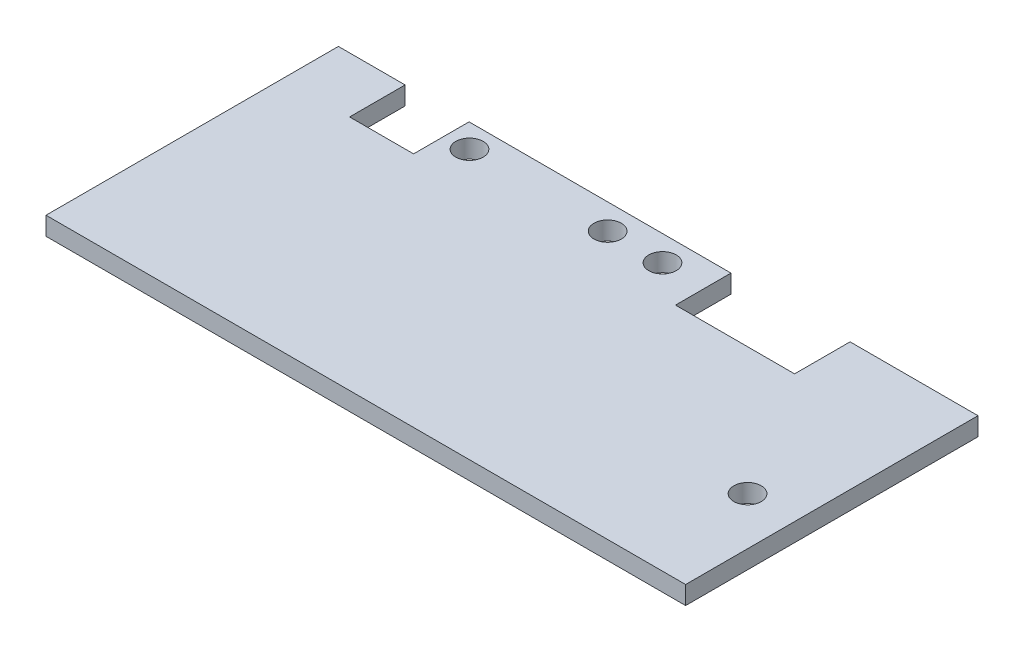
ISO-10303-21;
HEADER;
FILE_DESCRIPTION(('STEP AP214'),'2;1');
FILE_NAME('part.step','',(''),(''),'','','');
FILE_SCHEMA(('AUTOMOTIVE_DESIGN { 1 0 10303 214 1 1 1 1 }'));
ENDSEC;
DATA;
#1=APPLICATION_CONTEXT('core data for automotive mechanical design processes');
#2=APPLICATION_PROTOCOL_DEFINITION('international standard','automotive_design',2000,#1);
#3=PRODUCT_CONTEXT('',#1,'mechanical');
#4=PRODUCT('Part','Part','',(#3));
#5=PRODUCT_RELATED_PRODUCT_CATEGORY('part','',(#4));
#6=PRODUCT_DEFINITION_FORMATION('','',#4);
#7=PRODUCT_DEFINITION_CONTEXT('part definition',#1,'design');
#8=PRODUCT_DEFINITION('design','',#6,#7);
#9=PRODUCT_DEFINITION_SHAPE('','',#8);
#10=(LENGTH_UNIT() NAMED_UNIT(*) SI_UNIT(.MILLI.,.METRE.));
#11=(NAMED_UNIT(*) PLANE_ANGLE_UNIT() SI_UNIT($,.RADIAN.));
#12=(NAMED_UNIT(*) SI_UNIT($,.STERADIAN.) SOLID_ANGLE_UNIT());
#13=UNCERTAINTY_MEASURE_WITH_UNIT(LENGTH_MEASURE(1.E-05),#10,'distance_accuracy_value','');
#14=(GEOMETRIC_REPRESENTATION_CONTEXT(3) GLOBAL_UNCERTAINTY_ASSIGNED_CONTEXT((#13)) GLOBAL_UNIT_ASSIGNED_CONTEXT((#10,
#11,#12)) REPRESENTATION_CONTEXT('',''));
#15=CARTESIAN_POINT('',(0.,0.,0.));
#16=DIRECTION('',(0.,0.,1.));
#17=DIRECTION('',(1.,0.,0.));
#18=AXIS2_PLACEMENT_3D('',#15,#16,#17);
#19=CARTESIAN_POINT('',(35.,1.,0.));
#20=DIRECTION('',(0.,0.,-1.));
#21=DIRECTION('',(-1.,0.,0.));
#22=AXIS2_PLACEMENT_3D('',#19,#20,#21);
#23=PLANE('',#22);
#24=DIRECTION('',(1.,0.,0.));
#25=VECTOR('',#24,1.);
#26=CARTESIAN_POINT('',(35.,0.,0.));
#27=LINE('',#26,#25);
#28=CARTESIAN_POINT('',(0.,0.,0.));
#29=VERTEX_POINT('',#28);
#30=CARTESIAN_POINT('',(35.,0.,0.));
#31=VERTEX_POINT('',#30);
#32=EDGE_CURVE('E168',#29,#31,#27,.T.);
#33=ORIENTED_EDGE('',*,*,#32,.T.);
#34=DIRECTION('',(0.,-1.,0.));
#35=VECTOR('',#34,1.);
#36=CARTESIAN_POINT('',(35.,1.,0.));
#37=LINE('',#36,#35);
#38=CARTESIAN_POINT('',(35.,1.,0.));
#39=VERTEX_POINT('',#38);
#40=EDGE_CURVE('E11',#39,#31,#37,.T.);
#41=ORIENTED_EDGE('',*,*,#40,.F.);
#42=DIRECTION('',(1.,0.,0.));
#43=VECTOR('',#42,1.);
#44=CARTESIAN_POINT('',(35.,1.,0.));
#45=LINE('',#44,#43);
#46=CARTESIAN_POINT('',(0.,1.,0.));
#47=VERTEX_POINT('',#46);
#48=EDGE_CURVE('E203',#47,#39,#45,.T.);
#49=ORIENTED_EDGE('',*,*,#48,.F.);
#50=DIRECTION('',(0.,-1.,0.));
#51=VECTOR('',#50,1.);
#52=CARTESIAN_POINT('',(0.,1.,0.));
#53=LINE('',#52,#51);
#54=EDGE_CURVE('E164',#47,#29,#53,.T.);
#55=ORIENTED_EDGE('',*,*,#54,.T.);
#56=EDGE_LOOP('',(#33,#41,#49,#55));
#57=FACE_BOUND('',#56,.T.);
#58=ADVANCED_FACE('F43',(#57),#23,.F.);
#59=CARTESIAN_POINT('',(35.,1.,-16.));
#60=DIRECTION('',(-1.,0.,0.));
#61=DIRECTION('',(0.,0.,1.));
#62=AXIS2_PLACEMENT_3D('',#59,#60,#61);
#63=PLANE('',#62);
#64=DIRECTION('',(0.,0.,-1.));
#65=VECTOR('',#64,1.);
#66=CARTESIAN_POINT('',(35.,0.,-16.));
#67=LINE('',#66,#65);
#68=CARTESIAN_POINT('',(35.,0.,-16.));
#69=VERTEX_POINT('',#68);
#70=EDGE_CURVE('E172',#31,#69,#67,.T.);
#71=ORIENTED_EDGE('',*,*,#70,.T.);
#72=DIRECTION('',(0.,-1.,0.));
#73=VECTOR('',#72,1.);
#74=CARTESIAN_POINT('',(35.,1.,-16.));
#75=LINE('',#74,#73);
#76=CARTESIAN_POINT('',(35.,1.,-16.));
#77=VERTEX_POINT('',#76);
#78=EDGE_CURVE('E52',#77,#69,#75,.T.);
#79=ORIENTED_EDGE('',*,*,#78,.F.);
#80=DIRECTION('',(0.,0.,-1.));
#81=VECTOR('',#80,1.);
#82=CARTESIAN_POINT('',(35.,1.,-16.));
#83=LINE('',#82,#81);
#84=EDGE_CURVE('E115',#39,#77,#83,.T.);
#85=ORIENTED_EDGE('',*,*,#84,.F.);
#86=ORIENTED_EDGE('',*,*,#40,.T.);
#87=EDGE_LOOP('',(#71,#79,#85,#86));
#88=FACE_BOUND('',#87,.T.);
#89=ADVANCED_FACE('F298',(#88),#63,.F.);
#90=CARTESIAN_POINT('',(28.,1.,-16.));
#91=DIRECTION('',(0.,0.,1.));
#92=DIRECTION('',(1.,0.,0.));
#93=AXIS2_PLACEMENT_3D('',#90,#91,#92);
#94=PLANE('',#93);
#95=DIRECTION('',(-1.,0.,0.));
#96=VECTOR('',#95,1.);
#97=CARTESIAN_POINT('',(28.,0.,-16.));
#98=LINE('',#97,#96);
#99=CARTESIAN_POINT('',(28.,0.,-16.));
#100=VERTEX_POINT('',#99);
#101=EDGE_CURVE('E176',#69,#100,#98,.T.);
#102=ORIENTED_EDGE('',*,*,#101,.T.);
#103=DIRECTION('',(0.,-1.,0.));
#104=VECTOR('',#103,1.);
#105=CARTESIAN_POINT('',(28.,1.,-16.));
#106=LINE('',#105,#104);
#107=CARTESIAN_POINT('',(28.,1.,-16.));
#108=VERTEX_POINT('',#107);
#109=EDGE_CURVE('E230',#108,#100,#106,.T.);
#110=ORIENTED_EDGE('',*,*,#109,.F.);
#111=DIRECTION('',(-1.,0.,0.));
#112=VECTOR('',#111,1.);
#113=CARTESIAN_POINT('',(28.,1.,-16.));
#114=LINE('',#113,#112);
#115=EDGE_CURVE('E240',#77,#108,#114,.T.);
#116=ORIENTED_EDGE('',*,*,#115,.F.);
#117=ORIENTED_EDGE('',*,*,#78,.T.);
#118=EDGE_LOOP('',(#102,#110,#116,#117));
#119=FACE_BOUND('',#118,.T.);
#120=ADVANCED_FACE('F238',(#119),#94,.F.);
#121=CARTESIAN_POINT('',(28.,1.,-12.964));
#122=DIRECTION('',(1.,0.,0.));
#123=DIRECTION('',(0.,0.,-1.));
#124=AXIS2_PLACEMENT_3D('',#121,#122,#123);
#125=PLANE('',#124);
#126=DIRECTION('',(0.,0.,1.));
#127=VECTOR('',#126,1.);
#128=CARTESIAN_POINT('',(28.,0.,-12.964));
#129=LINE('',#128,#127);
#130=CARTESIAN_POINT('',(28.,0.,-12.964));
#131=VERTEX_POINT('',#130);
#132=EDGE_CURVE('E179',#100,#131,#129,.T.);
#133=ORIENTED_EDGE('',*,*,#132,.T.);
#134=DIRECTION('',(0.,-1.,0.));
#135=VECTOR('',#134,1.);
#136=CARTESIAN_POINT('',(28.,1.,-12.964));
#137=LINE('',#136,#135);
#138=CARTESIAN_POINT('',(28.,1.,-12.964));
#139=VERTEX_POINT('',#138);
#140=EDGE_CURVE('E226',#139,#131,#137,.T.);
#141=ORIENTED_EDGE('',*,*,#140,.F.);
#142=DIRECTION('',(0.,0.,1.));
#143=VECTOR('',#142,1.);
#144=CARTESIAN_POINT('',(28.,1.,-12.964));
#145=LINE('',#144,#143);
#146=EDGE_CURVE('E259',#108,#139,#145,.T.);
#147=ORIENTED_EDGE('',*,*,#146,.F.);
#148=ORIENTED_EDGE('',*,*,#109,.T.);
#149=EDGE_LOOP('',(#133,#141,#147,#148));
#150=FACE_BOUND('',#149,.T.);
#151=ADVANCED_FACE('F249',(#150),#125,.F.);
#152=CARTESIAN_POINT('',(21.483,1.,-12.964));
#153=DIRECTION('',(0.,0.,1.));
#154=DIRECTION('',(1.,0.,0.));
#155=AXIS2_PLACEMENT_3D('',#152,#153,#154);
#156=PLANE('',#155);
#157=DIRECTION('',(-1.,0.,0.));
#158=VECTOR('',#157,1.);
#159=CARTESIAN_POINT('',(21.483,0.,-12.964));
#160=LINE('',#159,#158);
#161=CARTESIAN_POINT('',(21.483,0.,-12.964));
#162=VERTEX_POINT('',#161);
#163=EDGE_CURVE('E182',#131,#162,#160,.T.);
#164=ORIENTED_EDGE('',*,*,#163,.T.);
#165=DIRECTION('',(0.,-1.,0.));
#166=VECTOR('',#165,1.);
#167=CARTESIAN_POINT('',(21.483,1.,-12.964));
#168=LINE('',#167,#166);
#169=CARTESIAN_POINT('',(21.483,1.,-12.964));
#170=VERTEX_POINT('',#169);
#171=EDGE_CURVE('E222',#170,#162,#168,.T.);
#172=ORIENTED_EDGE('',*,*,#171,.F.);
#173=DIRECTION('',(-1.,0.,0.));
#174=VECTOR('',#173,1.);
#175=CARTESIAN_POINT('',(21.483,1.,-12.964));
#176=LINE('',#175,#174);
#177=EDGE_CURVE('E255',#139,#170,#176,.T.);
#178=ORIENTED_EDGE('',*,*,#177,.F.);
#179=ORIENTED_EDGE('',*,*,#140,.T.);
#180=EDGE_LOOP('',(#164,#172,#178,#179));
#181=FACE_BOUND('',#180,.T.);
#182=ADVANCED_FACE('F253',(#181),#156,.F.);
#183=CARTESIAN_POINT('',(21.483,1.,-16.));
#184=DIRECTION('',(-1.,0.,0.));
#185=DIRECTION('',(0.,0.,1.));
#186=AXIS2_PLACEMENT_3D('',#183,#184,#185);
#187=PLANE('',#186);
#188=DIRECTION('',(0.,0.,-1.));
#189=VECTOR('',#188,1.);
#190=CARTESIAN_POINT('',(21.483,0.,-16.));
#191=LINE('',#190,#189);
#192=CARTESIAN_POINT('',(21.483,0.,-16.));
#193=VERTEX_POINT('',#192);
#194=EDGE_CURVE('E185',#162,#193,#191,.T.);
#195=ORIENTED_EDGE('',*,*,#194,.T.);
#196=DIRECTION('',(0.,-1.,0.));
#197=VECTOR('',#196,1.);
#198=CARTESIAN_POINT('',(21.483,1.,-16.));
#199=LINE('',#198,#197);
#200=CARTESIAN_POINT('',(21.483,1.,-16.));
#201=VERTEX_POINT('',#200);
#202=EDGE_CURVE('E218',#201,#193,#199,.T.);
#203=ORIENTED_EDGE('',*,*,#202,.F.);
#204=DIRECTION('',(0.,0.,-1.));
#205=VECTOR('',#204,1.);
#206=CARTESIAN_POINT('',(21.483,1.,-16.));
#207=LINE('',#206,#205);
#208=EDGE_CURVE('E258',#170,#201,#207,.T.);
#209=ORIENTED_EDGE('',*,*,#208,.F.);
#210=ORIENTED_EDGE('',*,*,#171,.T.);
#211=EDGE_LOOP('',(#195,#203,#209,#210));
#212=FACE_BOUND('',#211,.T.);
#213=ADVANCED_FACE('F311',(#212),#187,.F.);
#214=CARTESIAN_POINT('',(7.15,1.,-16.));
#215=DIRECTION('',(0.,0.,1.));
#216=DIRECTION('',(1.,0.,0.));
#217=AXIS2_PLACEMENT_3D('',#214,#215,#216);
#218=PLANE('',#217);
#219=DIRECTION('',(-1.,0.,0.));
#220=VECTOR('',#219,1.);
#221=CARTESIAN_POINT('',(7.15,0.,-16.));
#222=LINE('',#221,#220);
#223=CARTESIAN_POINT('',(7.15,0.,-16.));
#224=VERTEX_POINT('',#223);
#225=EDGE_CURVE('E188',#193,#224,#222,.T.);
#226=ORIENTED_EDGE('',*,*,#225,.T.);
#227=DIRECTION('',(0.,-1.,0.));
#228=VECTOR('',#227,1.);
#229=CARTESIAN_POINT('',(7.15,1.,-16.));
#230=LINE('',#229,#228);
#231=CARTESIAN_POINT('',(7.15,1.,-16.));
#232=VERTEX_POINT('',#231);
#233=EDGE_CURVE('E214',#232,#224,#230,.T.);
#234=ORIENTED_EDGE('',*,*,#233,.F.);
#235=DIRECTION('',(-1.,0.,0.));
#236=VECTOR('',#235,1.);
#237=CARTESIAN_POINT('',(7.15,1.,-16.));
#238=LINE('',#237,#236);
#239=EDGE_CURVE('E263',#201,#232,#238,.T.);
#240=ORIENTED_EDGE('',*,*,#239,.F.);
#241=ORIENTED_EDGE('',*,*,#202,.T.);
#242=EDGE_LOOP('',(#226,#234,#240,#241));
#243=FACE_BOUND('',#242,.T.);
#244=ADVANCED_FACE('F314',(#243),#218,.F.);
#245=CARTESIAN_POINT('',(7.15,1.,-12.964));
#246=DIRECTION('',(1.,0.,0.));
#247=DIRECTION('',(0.,0.,-1.));
#248=AXIS2_PLACEMENT_3D('',#245,#246,#247);
#249=PLANE('',#248);
#250=DIRECTION('',(0.,0.,1.));
#251=VECTOR('',#250,1.);
#252=CARTESIAN_POINT('',(7.15,0.,-12.964));
#253=LINE('',#252,#251);
#254=CARTESIAN_POINT('',(7.15,0.,-12.964));
#255=VERTEX_POINT('',#254);
#256=EDGE_CURVE('E191',#224,#255,#253,.T.);
#257=ORIENTED_EDGE('',*,*,#256,.T.);
#258=DIRECTION('',(0.,-1.,0.));
#259=VECTOR('',#258,1.);
#260=CARTESIAN_POINT('',(7.15,1.,-12.964));
#261=LINE('',#260,#259);
#262=CARTESIAN_POINT('',(7.15,1.,-12.964));
#263=VERTEX_POINT('',#262);
#264=EDGE_CURVE('E210',#263,#255,#261,.T.);
#265=ORIENTED_EDGE('',*,*,#264,.F.);
#266=DIRECTION('',(0.,0.,1.));
#267=VECTOR('',#266,1.);
#268=CARTESIAN_POINT('',(7.15,1.,-12.964));
#269=LINE('',#268,#267);
#270=EDGE_CURVE('E270',#232,#263,#269,.T.);
#271=ORIENTED_EDGE('',*,*,#270,.F.);
#272=ORIENTED_EDGE('',*,*,#233,.T.);
#273=EDGE_LOOP('',(#257,#265,#271,#272));
#274=FACE_BOUND('',#273,.T.);
#275=ADVANCED_FACE('F278',(#274),#249,.F.);
#276=CARTESIAN_POINT('',(3.65,1.,-12.964));
#277=DIRECTION('',(0.,0.,1.));
#278=DIRECTION('',(1.,0.,0.));
#279=AXIS2_PLACEMENT_3D('',#276,#277,#278);
#280=PLANE('',#279);
#281=DIRECTION('',(-1.,0.,0.));
#282=VECTOR('',#281,1.);
#283=CARTESIAN_POINT('',(3.65,0.,-12.964));
#284=LINE('',#283,#282);
#285=CARTESIAN_POINT('',(3.65,0.,-12.964));
#286=VERTEX_POINT('',#285);
#287=EDGE_CURVE('E194',#255,#286,#284,.T.);
#288=ORIENTED_EDGE('',*,*,#287,.T.);
#289=DIRECTION('',(0.,-1.,0.));
#290=VECTOR('',#289,1.);
#291=CARTESIAN_POINT('',(3.65,1.,-12.964));
#292=LINE('',#291,#290);
#293=CARTESIAN_POINT('',(3.65,1.,-12.964));
#294=VERTEX_POINT('',#293);
#295=EDGE_CURVE('E157',#294,#286,#292,.T.);
#296=ORIENTED_EDGE('',*,*,#295,.F.);
#297=DIRECTION('',(-1.,0.,0.));
#298=VECTOR('',#297,1.);
#299=CARTESIAN_POINT('',(3.65,1.,-12.964));
#300=LINE('',#299,#298);
#301=EDGE_CURVE('E146',#263,#294,#300,.T.);
#302=ORIENTED_EDGE('',*,*,#301,.F.);
#303=ORIENTED_EDGE('',*,*,#264,.T.);
#304=EDGE_LOOP('',(#288,#296,#302,#303));
#305=FACE_BOUND('',#304,.T.);
#306=ADVANCED_FACE('F282',(#305),#280,.F.);
#307=CARTESIAN_POINT('',(3.65,1.,-16.));
#308=DIRECTION('',(-1.,0.,0.));
#309=DIRECTION('',(0.,0.,1.));
#310=AXIS2_PLACEMENT_3D('',#307,#308,#309);
#311=PLANE('',#310);
#312=DIRECTION('',(0.,0.,-1.));
#313=VECTOR('',#312,1.);
#314=CARTESIAN_POINT('',(3.65,0.,-16.));
#315=LINE('',#314,#313);
#316=CARTESIAN_POINT('',(3.65,0.,-16.));
#317=VERTEX_POINT('',#316);
#318=EDGE_CURVE('E155',#286,#317,#315,.T.);
#319=ORIENTED_EDGE('',*,*,#318,.T.);
#320=DIRECTION('',(0.,-1.,0.));
#321=VECTOR('',#320,1.);
#322=CARTESIAN_POINT('',(3.65,1.,-16.));
#323=LINE('',#322,#321);
#324=CARTESIAN_POINT('',(3.65,1.,-16.));
#325=VERTEX_POINT('',#324);
#326=EDGE_CURVE('E152',#325,#317,#323,.T.);
#327=ORIENTED_EDGE('',*,*,#326,.F.);
#328=DIRECTION('',(0.,0.,-1.));
#329=VECTOR('',#328,1.);
#330=CARTESIAN_POINT('',(3.65,1.,-16.));
#331=LINE('',#330,#329);
#332=EDGE_CURVE('E140',#294,#325,#331,.T.);
#333=ORIENTED_EDGE('',*,*,#332,.F.);
#334=ORIENTED_EDGE('',*,*,#295,.T.);
#335=EDGE_LOOP('',(#319,#327,#333,#334));
#336=FACE_BOUND('',#335,.T.);
#337=ADVANCED_FACE('F153',(#336),#311,.F.);
#338=CARTESIAN_POINT('',(0.,1.,-16.));
#339=DIRECTION('',(0.,0.,1.));
#340=DIRECTION('',(1.,0.,0.));
#341=AXIS2_PLACEMENT_3D('',#338,#339,#340);
#342=PLANE('',#341);
#343=DIRECTION('',(-1.,0.,0.));
#344=VECTOR('',#343,1.);
#345=CARTESIAN_POINT('',(0.,0.,-16.));
#346=LINE('',#345,#344);
#347=CARTESIAN_POINT('',(0.,0.,-16.));
#348=VERTEX_POINT('',#347);
#349=EDGE_CURVE('E101',#317,#348,#346,.T.);
#350=ORIENTED_EDGE('',*,*,#349,.T.);
#351=DIRECTION('',(0.,-1.,0.));
#352=VECTOR('',#351,1.);
#353=CARTESIAN_POINT('',(0.,1.,-16.));
#354=LINE('',#353,#352);
#355=CARTESIAN_POINT('',(0.,1.,-16.));
#356=VERTEX_POINT('',#355);
#357=EDGE_CURVE('E158',#356,#348,#354,.T.);
#358=ORIENTED_EDGE('',*,*,#357,.F.);
#359=DIRECTION('',(-1.,0.,0.));
#360=VECTOR('',#359,1.);
#361=CARTESIAN_POINT('',(0.,1.,-16.));
#362=LINE('',#361,#360);
#363=EDGE_CURVE('E144',#325,#356,#362,.T.);
#364=ORIENTED_EDGE('',*,*,#363,.F.);
#365=ORIENTED_EDGE('',*,*,#326,.T.);
#366=EDGE_LOOP('',(#350,#358,#364,#365));
#367=FACE_BOUND('',#366,.T.);
#368=ADVANCED_FACE('F160',(#367),#342,.F.);
#369=CARTESIAN_POINT('',(0.,1.,0.));
#370=DIRECTION('',(1.,0.,0.));
#371=DIRECTION('',(0.,0.,-1.));
#372=AXIS2_PLACEMENT_3D('',#369,#370,#371);
#373=PLANE('',#372);
#374=DIRECTION('',(0.,0.,1.));
#375=VECTOR('',#374,1.);
#376=CARTESIAN_POINT('',(0.,0.,0.));
#377=LINE('',#376,#375);
#378=EDGE_CURVE('E107',#348,#29,#377,.T.);
#379=ORIENTED_EDGE('',*,*,#378,.T.);
#380=ORIENTED_EDGE('',*,*,#54,.F.);
#381=DIRECTION('',(0.,0.,1.));
#382=VECTOR('',#381,1.);
#383=CARTESIAN_POINT('',(0.,1.,0.));
#384=LINE('',#383,#382);
#385=EDGE_CURVE('E60',#356,#47,#384,.T.);
#386=ORIENTED_EDGE('',*,*,#385,.F.);
#387=ORIENTED_EDGE('',*,*,#357,.T.);
#388=EDGE_LOOP('',(#379,#380,#386,#387));
#389=FACE_BOUND('',#388,.T.);
#390=ADVANCED_FACE('F286',(#389),#373,.F.);
#391=CARTESIAN_POINT('',(0.,1.,0.));
#392=DIRECTION('',(0.,-1.,0.));
#393=DIRECTION('',(0.,0.,-1.));
#394=AXIS2_PLACEMENT_3D('',#391,#392,#393);
#395=PLANE('',#394);
#396=CARTESIAN_POINT('',(8.46,1.,-14.713));
#397=DIRECTION('',(0.,1.,0.));
#398=DIRECTION('',(0.,0.,1.));
#399=AXIS2_PLACEMENT_3D('',#396,#397,#398);
#400=CIRCLE('',#399,0.750000000000002);
#401=CARTESIAN_POINT('',(8.46,1.,-13.963));
#402=VERTEX_POINT('',#401);
#403=EDGE_CURVE('E486',#402,#402,#400,.T.);
#404=ORIENTED_EDGE('',*,*,#403,.F.);
#405=EDGE_LOOP('',(#404));
#406=FACE_BOUND('',#405,.T.);
#407=CARTESIAN_POINT('',(16.121,1.,-14.613));
#408=DIRECTION('',(0.,1.,0.));
#409=DIRECTION('',(0.,0.,1.));
#410=AXIS2_PLACEMENT_3D('',#407,#408,#409);
#411=CIRCLE('',#410,0.749999999999999);
#412=CARTESIAN_POINT('',(16.121,1.,-13.863));
#413=VERTEX_POINT('',#412);
#414=EDGE_CURVE('E488',#413,#413,#411,.T.);
#415=ORIENTED_EDGE('',*,*,#414,.F.);
#416=EDGE_LOOP('',(#415));
#417=FACE_BOUND('',#416,.T.);
#418=CARTESIAN_POINT('',(19.121,1.,-14.613));
#419=DIRECTION('',(0.,1.,0.));
#420=DIRECTION('',(0.,0.,1.));
#421=AXIS2_PLACEMENT_3D('',#418,#419,#420);
#422=CIRCLE('',#421,0.749999999999999);
#423=CARTESIAN_POINT('',(19.121,1.,-13.863));
#424=VERTEX_POINT('',#423);
#425=EDGE_CURVE('E501',#424,#424,#422,.T.);
#426=ORIENTED_EDGE('',*,*,#425,.F.);
#427=EDGE_LOOP('',(#426));
#428=FACE_BOUND('',#427,.T.);
#429=CARTESIAN_POINT('',(32.39,1.,-6.));
#430=DIRECTION('',(0.,1.,0.));
#431=DIRECTION('',(0.,0.,1.));
#432=AXIS2_PLACEMENT_3D('',#429,#430,#431);
#433=CIRCLE('',#432,0.749999999999999);
#434=CARTESIAN_POINT('',(32.39,1.,-5.25));
#435=VERTEX_POINT('',#434);
#436=EDGE_CURVE('E492',#435,#435,#433,.T.);
#437=ORIENTED_EDGE('',*,*,#436,.F.);
#438=EDGE_LOOP('',(#437));
#439=FACE_BOUND('',#438,.T.);
#440=ORIENTED_EDGE('',*,*,#48,.T.);
#441=ORIENTED_EDGE('',*,*,#84,.T.);
#442=ORIENTED_EDGE('',*,*,#115,.T.);
#443=ORIENTED_EDGE('',*,*,#146,.T.);
#444=ORIENTED_EDGE('',*,*,#177,.T.);
#445=ORIENTED_EDGE('',*,*,#208,.T.);
#446=ORIENTED_EDGE('',*,*,#239,.T.);
#447=ORIENTED_EDGE('',*,*,#270,.T.);
#448=ORIENTED_EDGE('',*,*,#301,.T.);
#449=ORIENTED_EDGE('',*,*,#332,.T.);
#450=ORIENTED_EDGE('',*,*,#363,.T.);
#451=ORIENTED_EDGE('',*,*,#385,.T.);
#452=EDGE_LOOP('',(#440,#441,#442,#443,#444,#445,#446,#447,#448,#449,#450,#451));
#453=FACE_BOUND('',#452,.T.);
#454=ADVANCED_FACE('F142',(#406,#417,#428,#439,#453),#395,.F.);
#455=CARTESIAN_POINT('',(0.,0.,0.));
#456=DIRECTION('',(0.,-1.,0.));
#457=DIRECTION('',(0.,0.,-1.));
#458=AXIS2_PLACEMENT_3D('',#455,#456,#457);
#459=PLANE('',#458);
#460=CARTESIAN_POINT('',(8.46,0.,-14.713));
#461=DIRECTION('',(0.,1.,0.));
#462=DIRECTION('',(0.,0.,1.));
#463=AXIS2_PLACEMENT_3D('',#460,#461,#462);
#464=CIRCLE('',#463,0.750000000000002);
#465=CARTESIAN_POINT('',(8.46,0.,-13.963));
#466=VERTEX_POINT('',#465);
#467=EDGE_CURVE('E483',#466,#466,#464,.T.);
#468=ORIENTED_EDGE('',*,*,#467,.T.);
#469=EDGE_LOOP('',(#468));
#470=FACE_BOUND('',#469,.T.);
#471=CARTESIAN_POINT('',(16.121,0.,-14.613));
#472=DIRECTION('',(0.,1.,0.));
#473=DIRECTION('',(0.,0.,1.));
#474=AXIS2_PLACEMENT_3D('',#471,#472,#473);
#475=CIRCLE('',#474,0.749999999999999);
#476=CARTESIAN_POINT('',(16.121,0.,-13.863));
#477=VERTEX_POINT('',#476);
#478=EDGE_CURVE('E495',#477,#477,#475,.T.);
#479=ORIENTED_EDGE('',*,*,#478,.T.);
#480=EDGE_LOOP('',(#479));
#481=FACE_BOUND('',#480,.T.);
#482=CARTESIAN_POINT('',(19.121,0.,-14.613));
#483=DIRECTION('',(0.,1.,0.));
#484=DIRECTION('',(0.,0.,1.));
#485=AXIS2_PLACEMENT_3D('',#482,#483,#484);
#486=CIRCLE('',#485,0.749999999999999);
#487=CARTESIAN_POINT('',(19.121,0.,-13.863));
#488=VERTEX_POINT('',#487);
#489=EDGE_CURVE('E505',#488,#488,#486,.T.);
#490=ORIENTED_EDGE('',*,*,#489,.T.);
#491=EDGE_LOOP('',(#490));
#492=FACE_BOUND('',#491,.T.);
#493=CARTESIAN_POINT('',(32.39,0.,-6.));
#494=DIRECTION('',(0.,1.,0.));
#495=DIRECTION('',(0.,0.,1.));
#496=AXIS2_PLACEMENT_3D('',#493,#494,#495);
#497=CIRCLE('',#496,0.749999999999999);
#498=CARTESIAN_POINT('',(32.39,0.,-5.25));
#499=VERTEX_POINT('',#498);
#500=EDGE_CURVE('E173',#499,#499,#497,.T.);
#501=ORIENTED_EDGE('',*,*,#500,.T.);
#502=EDGE_LOOP('',(#501));
#503=FACE_BOUND('',#502,.T.);
#504=ORIENTED_EDGE('',*,*,#32,.F.);
#505=ORIENTED_EDGE('',*,*,#378,.F.);
#506=ORIENTED_EDGE('',*,*,#349,.F.);
#507=ORIENTED_EDGE('',*,*,#318,.F.);
#508=ORIENTED_EDGE('',*,*,#287,.F.);
#509=ORIENTED_EDGE('',*,*,#256,.F.);
#510=ORIENTED_EDGE('',*,*,#225,.F.);
#511=ORIENTED_EDGE('',*,*,#194,.F.);
#512=ORIENTED_EDGE('',*,*,#163,.F.);
#513=ORIENTED_EDGE('',*,*,#132,.F.);
#514=ORIENTED_EDGE('',*,*,#101,.F.);
#515=ORIENTED_EDGE('',*,*,#70,.F.);
#516=EDGE_LOOP('',(#504,#505,#506,#507,#508,#509,#510,#511,#512,#513,#514,#515));
#517=FACE_BOUND('',#516,.T.);
#518=ADVANCED_FACE('F244',(#470,#481,#492,#503,#517),#459,.T.);
#519=CARTESIAN_POINT('',(32.39,0.,-6.));
#520=DIRECTION('',(0.,1.,0.));
#521=DIRECTION('',(0.,0.,1.));
#522=AXIS2_PLACEMENT_3D('',#519,#520,#521);
#523=CYLINDRICAL_SURFACE('',#522,0.749999999999999);
#524=ORIENTED_EDGE('',*,*,#500,.F.);
#525=EDGE_LOOP('',(#524));
#526=FACE_BOUND('',#525,.T.);
#527=ORIENTED_EDGE('',*,*,#436,.T.);
#528=EDGE_LOOP('',(#527));
#529=FACE_BOUND('',#528,.T.);
#530=ADVANCED_FACE('F344',(#526,#529),#523,.F.);
#531=CARTESIAN_POINT('',(19.121,0.,-14.613));
#532=DIRECTION('',(0.,1.,0.));
#533=DIRECTION('',(0.,0.,1.));
#534=AXIS2_PLACEMENT_3D('',#531,#532,#533);
#535=CYLINDRICAL_SURFACE('',#534,0.749999999999999);
#536=ORIENTED_EDGE('',*,*,#489,.F.);
#537=EDGE_LOOP('',(#536));
#538=FACE_BOUND('',#537,.T.);
#539=ORIENTED_EDGE('',*,*,#425,.T.);
#540=EDGE_LOOP('',(#539));
#541=FACE_BOUND('',#540,.T.);
#542=ADVANCED_FACE('F349',(#538,#541),#535,.F.);
#543=CARTESIAN_POINT('',(16.121,0.,-14.613));
#544=DIRECTION('',(0.,1.,0.));
#545=DIRECTION('',(0.,0.,1.));
#546=AXIS2_PLACEMENT_3D('',#543,#544,#545);
#547=CYLINDRICAL_SURFACE('',#546,0.749999999999999);
#548=ORIENTED_EDGE('',*,*,#478,.F.);
#549=EDGE_LOOP('',(#548));
#550=FACE_BOUND('',#549,.T.);
#551=ORIENTED_EDGE('',*,*,#414,.T.);
#552=EDGE_LOOP('',(#551));
#553=FACE_BOUND('',#552,.T.);
#554=ADVANCED_FACE('F375',(#550,#553),#547,.F.);
#555=CARTESIAN_POINT('',(8.46,0.,-14.713));
#556=DIRECTION('',(0.,1.,0.));
#557=DIRECTION('',(0.,0.,1.));
#558=AXIS2_PLACEMENT_3D('',#555,#556,#557);
#559=CYLINDRICAL_SURFACE('',#558,0.750000000000002);
#560=ORIENTED_EDGE('',*,*,#467,.F.);
#561=EDGE_LOOP('',(#560));
#562=FACE_BOUND('',#561,.T.);
#563=ORIENTED_EDGE('',*,*,#403,.T.);
#564=EDGE_LOOP('',(#563));
#565=FACE_BOUND('',#564,.T.);
#566=ADVANCED_FACE('F386',(#562,#565),#559,.F.);
#567=CLOSED_SHELL('',(#58,#89,#120,#151,#182,#213,#244,#275,#306,#337,#368,#390,#454,#518,#530,
#542,#554,#566));
#568=MANIFOLD_SOLID_BREP('B2',#567);
#569=ADVANCED_BREP_SHAPE_REPRESENTATION('',(#18,#568),#14);
#570=SHAPE_DEFINITION_REPRESENTATION(#9,#569);
ENDSEC;
END-ISO-10303-21;
